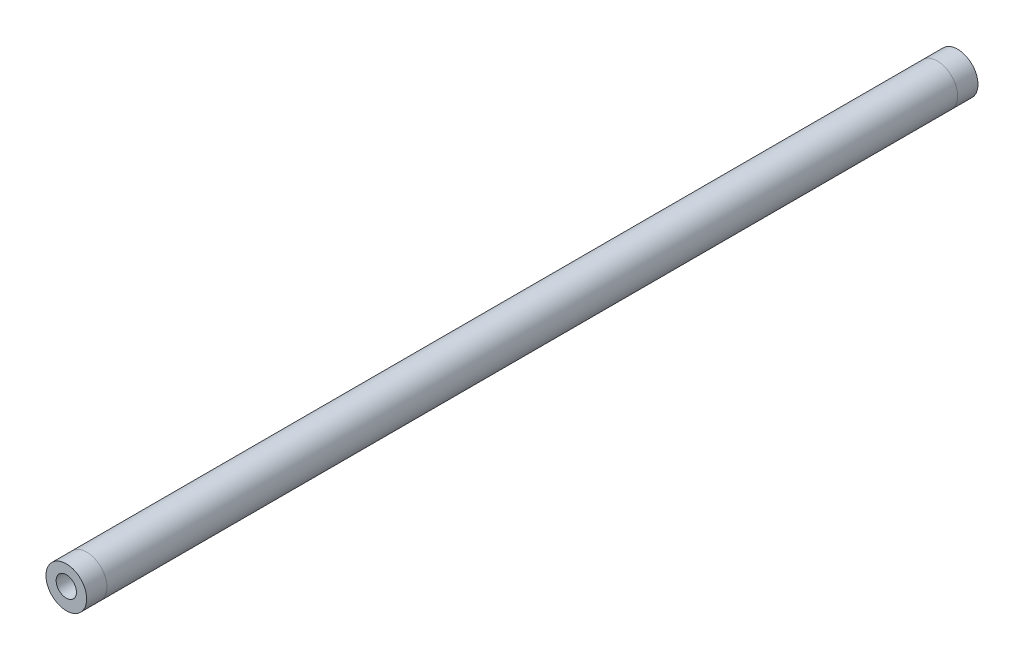
ISO-10303-21;
HEADER;
FILE_DESCRIPTION(('STEP AP214'),'2;1');
FILE_NAME('part.step','',(''),(''),'','','');
FILE_SCHEMA(('AUTOMOTIVE_DESIGN { 1 0 10303 214 1 1 1 1 }'));
ENDSEC;
DATA;
#1=APPLICATION_CONTEXT('core data for automotive mechanical design processes');
#2=APPLICATION_PROTOCOL_DEFINITION('international standard','automotive_design',2000,#1);
#3=PRODUCT_CONTEXT('',#1,'mechanical');
#4=PRODUCT('Part','Part','',(#3));
#5=PRODUCT_RELATED_PRODUCT_CATEGORY('part','',(#4));
#6=PRODUCT_DEFINITION_FORMATION('','',#4);
#7=PRODUCT_DEFINITION_CONTEXT('part definition',#1,'design');
#8=PRODUCT_DEFINITION('design','',#6,#7);
#9=PRODUCT_DEFINITION_SHAPE('','',#8);
#10=(LENGTH_UNIT() NAMED_UNIT(*) SI_UNIT(.MILLI.,.METRE.));
#11=(NAMED_UNIT(*) PLANE_ANGLE_UNIT() SI_UNIT($,.RADIAN.));
#12=(NAMED_UNIT(*) SI_UNIT($,.STERADIAN.) SOLID_ANGLE_UNIT());
#13=UNCERTAINTY_MEASURE_WITH_UNIT(LENGTH_MEASURE(1.E-05),#10,'distance_accuracy_value','');
#14=(GEOMETRIC_REPRESENTATION_CONTEXT(3) GLOBAL_UNCERTAINTY_ASSIGNED_CONTEXT((#13)) GLOBAL_UNIT_ASSIGNED_CONTEXT((#10,
#11,#12)) REPRESENTATION_CONTEXT('',''));
#15=CARTESIAN_POINT('',(0.,0.,0.));
#16=DIRECTION('',(0.,0.,1.));
#17=DIRECTION('',(1.,0.,0.));
#18=AXIS2_PLACEMENT_3D('',#15,#16,#17);
#19=CARTESIAN_POINT('',(0.,0.,-311.692360642138));
#20=DIRECTION('',(0.,0.,1.));
#21=DIRECTION('',(1.,0.,0.));
#22=AXIS2_PLACEMENT_3D('',#19,#20,#21);
#23=CYLINDRICAL_SURFACE('',#22,6.35);
#24=CARTESIAN_POINT('',(0.,0.,-293.7318484));
#25=DIRECTION('',(0.,0.,1.));
#26=DIRECTION('',(1.,0.,0.));
#27=AXIS2_PLACEMENT_3D('',#24,#25,#26);
#28=CIRCLE('',#27,6.35);
#29=CARTESIAN_POINT('',(6.35,0.,-293.7318484));
#30=VERTEX_POINT('',#29);
#31=EDGE_CURVE('E12',#30,#30,#28,.F.);
#32=ORIENTED_EDGE('',*,*,#31,.F.);
#33=EDGE_LOOP('',(#32));
#34=FACE_BOUND('',#33,.T.);
#35=CARTESIAN_POINT('',(0.,0.,-28.2575));
#36=DIRECTION('',(0.,0.,1.));
#37=DIRECTION('',(1.,0.,0.));
#38=AXIS2_PLACEMENT_3D('',#35,#36,#37);
#39=CIRCLE('',#38,6.35);
#40=CARTESIAN_POINT('',(6.35,0.,-28.2575));
#41=VERTEX_POINT('',#40);
#42=EDGE_CURVE('E77',#41,#41,#39,.T.);
#43=ORIENTED_EDGE('',*,*,#42,.F.);
#44=EDGE_LOOP('',(#43));
#45=FACE_BOUND('',#44,.T.);
#46=ADVANCED_FACE('F66',(#34,#45),#23,.T.);
#47=CARTESIAN_POINT('',(0.,0.,-28.2575));
#48=DIRECTION('',(0.,0.,1.));
#49=DIRECTION('',(1.,0.,0.));
#50=AXIS2_PLACEMENT_3D('',#47,#48,#49);
#51=PLANE('',#50);
#52=CARTESIAN_POINT('',(0.,0.,-28.2575));
#53=DIRECTION('',(0.,0.,1.));
#54=DIRECTION('',(1.,0.,0.));
#55=AXIS2_PLACEMENT_3D('',#52,#53,#54);
#56=CIRCLE('',#55,4.7625);
#57=CARTESIAN_POINT('',(4.7625,0.,-28.2575));
#58=VERTEX_POINT('',#57);
#59=EDGE_CURVE('E79',#58,#58,#56,.T.);
#60=ORIENTED_EDGE('',*,*,#59,.F.);
#61=EDGE_LOOP('',(#60));
#62=FACE_BOUND('',#61,.T.);
#63=ORIENTED_EDGE('',*,*,#42,.T.);
#64=EDGE_LOOP('',(#63));
#65=FACE_BOUND('',#64,.T.);
#66=ADVANCED_FACE('F84',(#62,#65),#51,.T.);
#67=CARTESIAN_POINT('',(0.,0.,-311.692360642138));
#68=DIRECTION('',(0.,0.,1.));
#69=DIRECTION('',(1.,0.,0.));
#70=AXIS2_PLACEMENT_3D('',#67,#68,#69);
#71=CYLINDRICAL_SURFACE('',#70,4.7625);
#72=CARTESIAN_POINT('',(0.,0.,-293.7318484));
#73=DIRECTION('',(0.,0.,1.));
#74=DIRECTION('',(1.,0.,0.));
#75=AXIS2_PLACEMENT_3D('',#72,#73,#74);
#76=CIRCLE('',#75,4.7625);
#77=CARTESIAN_POINT('',(4.7625,0.,-293.7318484));
#78=VERTEX_POINT('',#77);
#79=EDGE_CURVE('E69',#78,#78,#76,.F.);
#80=ORIENTED_EDGE('',*,*,#79,.T.);
#81=EDGE_LOOP('',(#80));
#82=FACE_BOUND('',#81,.T.);
#83=ORIENTED_EDGE('',*,*,#59,.T.);
#84=EDGE_LOOP('',(#83));
#85=FACE_BOUND('',#84,.T.);
#86=ADVANCED_FACE('F91',(#82,#85),#71,.F.);
#87=CARTESIAN_POINT('',(0.,0.,-293.7318484));
#88=DIRECTION('',(0.,0.,1.));
#89=DIRECTION('',(1.,0.,0.));
#90=AXIS2_PLACEMENT_3D('',#87,#88,#89);
#91=PLANE('',#90);
#92=ORIENTED_EDGE('',*,*,#31,.T.);
#93=EDGE_LOOP('',(#92));
#94=FACE_BOUND('',#93,.T.);
#95=ORIENTED_EDGE('',*,*,#79,.F.);
#96=EDGE_LOOP('',(#95));
#97=FACE_BOUND('',#96,.T.);
#98=ADVANCED_FACE('F96',(#94,#97),#91,.F.);
#99=CLOSED_SHELL('',(#46,#66,#86,#98));
#100=MANIFOLD_SOLID_BREP('B2',#99);
#101=CARTESIAN_POINT('',(0.,0.,-293.7318484));
#102=DIRECTION('',(0.,0.,1.));
#103=DIRECTION('',(1.,0.,0.));
#104=AXIS2_PLACEMENT_3D('',#101,#102,#103);
#105=PLANE('',#104);
#106=CARTESIAN_POINT('',(0.,0.,-293.7318484));
#107=DIRECTION('',(0.,0.,1.));
#108=DIRECTION('',(1.,0.,0.));
#109=AXIS2_PLACEMENT_3D('',#106,#107,#108);
#110=CIRCLE('',#109,6.35);
#111=CARTESIAN_POINT('',(6.35,0.,-293.7318484));
#112=VERTEX_POINT('',#111);
#113=EDGE_CURVE('E65',#112,#112,#110,.T.);
#114=ORIENTED_EDGE('',*,*,#113,.T.);
#115=EDGE_LOOP('',(#114));
#116=FACE_BOUND('',#115,.T.);
#117=CARTESIAN_POINT('',(0.,0.,-293.7318484));
#118=DIRECTION('',(0.,0.,1.));
#119=DIRECTION('',(1.,0.,0.));
#120=AXIS2_PLACEMENT_3D('',#117,#118,#119);
#121=CIRCLE('',#120,4.7625);
#122=CARTESIAN_POINT('',(-4.7625,0.,-293.7318484));
#123=VERTEX_POINT('',#122);
#124=EDGE_CURVE('E149',#123,#123,#121,.T.);
#125=ORIENTED_EDGE('',*,*,#124,.F.);
#126=EDGE_LOOP('',(#125));
#127=FACE_BOUND('',#126,.T.);
#128=ADVANCED_FACE('F135',(#116,#127),#105,.T.);
#129=CARTESIAN_POINT('',(0.,0.,-293.7318484));
#130=DIRECTION('',(0.,0.,-1.));
#131=DIRECTION('',(-1.,0.,0.));
#132=AXIS2_PLACEMENT_3D('',#129,#130,#131);
#133=CYLINDRICAL_SURFACE('',#132,6.35);
#134=ORIENTED_EDGE('',*,*,#113,.F.);
#135=EDGE_LOOP('',(#134));
#136=FACE_BOUND('',#135,.T.);
#137=CARTESIAN_POINT('',(0.,0.,-300.0818484));
#138=DIRECTION('',(0.,0.,1.));
#139=DIRECTION('',(1.,0.,0.));
#140=AXIS2_PLACEMENT_3D('',#137,#138,#139);
#141=CIRCLE('',#140,6.35);
#142=CARTESIAN_POINT('',(6.35,0.,-300.0818484));
#143=VERTEX_POINT('',#142);
#144=EDGE_CURVE('E147',#143,#143,#141,.T.);
#145=ORIENTED_EDGE('',*,*,#144,.T.);
#146=EDGE_LOOP('',(#145));
#147=FACE_BOUND('',#146,.T.);
#148=ADVANCED_FACE('F137',(#136,#147),#133,.T.);
#149=CARTESIAN_POINT('',(0.,0.235008438761634,-293.7318484));
#150=DIRECTION('',(0.,0.,-1.));
#151=DIRECTION('',(-1.,0.,0.));
#152=AXIS2_PLACEMENT_3D('',#149,#150,#151);
#153=CYLINDRICAL_SURFACE('',#152,3.175);
#154=CARTESIAN_POINT('',(0.,0.235008438761634,-300.0818484));
#155=DIRECTION('',(0.,0.,1.));
#156=DIRECTION('',(1.,0.,0.));
#157=AXIS2_PLACEMENT_3D('',#154,#155,#156);
#158=CIRCLE('',#157,3.175);
#159=CARTESIAN_POINT('',(3.175,0.235008438761634,-300.0818484));
#160=VERTEX_POINT('',#159);
#161=EDGE_CURVE('E139',#160,#160,#158,.T.);
#162=ORIENTED_EDGE('',*,*,#161,.F.);
#163=EDGE_LOOP('',(#162));
#164=FACE_BOUND('',#163,.T.);
#165=CARTESIAN_POINT('',(0.,0.235008438761634,-284.2068484));
#166=DIRECTION('',(0.,0.,1.));
#167=DIRECTION('',(1.,0.,0.));
#168=AXIS2_PLACEMENT_3D('',#165,#166,#167);
#169=CIRCLE('',#168,3.175);
#170=CARTESIAN_POINT('',(3.175,0.235008438761634,-284.2068484));
#171=VERTEX_POINT('',#170);
#172=EDGE_CURVE('E159',#171,#171,#169,.T.);
#173=ORIENTED_EDGE('',*,*,#172,.T.);
#174=EDGE_LOOP('',(#173));
#175=FACE_BOUND('',#174,.T.);
#176=ADVANCED_FACE('F164',(#164,#175),#153,.F.);
#177=CARTESIAN_POINT('',(0.,0.,-300.0818484));
#178=DIRECTION('',(0.,0.,1.));
#179=DIRECTION('',(1.,0.,0.));
#180=AXIS2_PLACEMENT_3D('',#177,#178,#179);
#181=PLANE('',#180);
#182=ORIENTED_EDGE('',*,*,#144,.F.);
#183=EDGE_LOOP('',(#182));
#184=FACE_BOUND('',#183,.T.);
#185=ORIENTED_EDGE('',*,*,#161,.T.);
#186=EDGE_LOOP('',(#185));
#187=FACE_BOUND('',#186,.T.);
#188=ADVANCED_FACE('F169',(#184,#187),#181,.F.);
#189=CARTESIAN_POINT('',(0.,0.,-284.2068484));
#190=DIRECTION('',(0.,0.,1.));
#191=DIRECTION('',(1.,0.,0.));
#192=AXIS2_PLACEMENT_3D('',#189,#190,#191);
#193=PLANE('',#192);
#194=CARTESIAN_POINT('',(0.,0.,-284.2068484));
#195=DIRECTION('',(0.,0.,1.));
#196=DIRECTION('',(1.,0.,0.));
#197=AXIS2_PLACEMENT_3D('',#194,#195,#196);
#198=CIRCLE('',#197,4.7625);
#199=CARTESIAN_POINT('',(-4.7625,0.,-284.2068484));
#200=VERTEX_POINT('',#199);
#201=EDGE_CURVE('E152',#200,#200,#198,.T.);
#202=ORIENTED_EDGE('',*,*,#201,.T.);
#203=EDGE_LOOP('',(#202));
#204=FACE_BOUND('',#203,.T.);
#205=ORIENTED_EDGE('',*,*,#172,.F.);
#206=EDGE_LOOP('',(#205));
#207=FACE_BOUND('',#206,.T.);
#208=ADVANCED_FACE('F166',(#204,#207),#193,.T.);
#209=CARTESIAN_POINT('',(0.,0.,-284.2068484));
#210=DIRECTION('',(0.,0.,-1.));
#211=DIRECTION('',(-1.,0.,0.));
#212=AXIS2_PLACEMENT_3D('',#209,#210,#211);
#213=CYLINDRICAL_SURFACE('',#212,4.7625);
#214=CARTESIAN_POINT('',(-4.7625,0.,-284.2068484));
#215=CARTESIAN_POINT('',(-4.7625,0.,-284.30606715));
#216=CARTESIAN_POINT('',(-4.7625,0.,-284.4052859));
#217=CARTESIAN_POINT('',(-4.7625,0.,-284.6037234));
#218=CARTESIAN_POINT('',(-4.7625,0.,-284.70294215));
#219=CARTESIAN_POINT('',(-4.7625,0.,-284.90137965));
#220=CARTESIAN_POINT('',(-4.7625,0.,-285.0005984));
#221=CARTESIAN_POINT('',(-4.7625,0.,-285.1990359));
#222=CARTESIAN_POINT('',(-4.7625,0.,-285.29825465));
#223=CARTESIAN_POINT('',(-4.7625,0.,-285.49669215));
#224=CARTESIAN_POINT('',(-4.7625,0.,-285.5959109));
#225=CARTESIAN_POINT('',(-4.7625,0.,-285.7943484));
#226=CARTESIAN_POINT('',(-4.7625,0.,-285.89356715));
#227=CARTESIAN_POINT('',(-4.7625,0.,-286.09200465));
#228=CARTESIAN_POINT('',(-4.7625,0.,-286.1912234));
#229=CARTESIAN_POINT('',(-4.7625,0.,-286.3896609));
#230=CARTESIAN_POINT('',(-4.7625,0.,-286.48887965));
#231=CARTESIAN_POINT('',(-4.7625,0.,-286.68731715));
#232=CARTESIAN_POINT('',(-4.7625,0.,-286.7865359));
#233=CARTESIAN_POINT('',(-4.7625,0.,-286.9849734));
#234=CARTESIAN_POINT('',(-4.7625,0.,-287.08419215));
#235=CARTESIAN_POINT('',(-4.7625,0.,-287.28262965));
#236=CARTESIAN_POINT('',(-4.7625,0.,-287.3818484));
#237=CARTESIAN_POINT('',(-4.7625,0.,-287.5802859));
#238=CARTESIAN_POINT('',(-4.7625,0.,-287.67950465));
#239=CARTESIAN_POINT('',(-4.7625,0.,-287.87794215));
#240=CARTESIAN_POINT('',(-4.7625,0.,-287.9771609));
#241=CARTESIAN_POINT('',(-4.7625,0.,-288.1755984));
#242=CARTESIAN_POINT('',(-4.7625,0.,-288.27481715));
#243=CARTESIAN_POINT('',(-4.7625,0.,-288.47325465));
#244=CARTESIAN_POINT('',(-4.7625,0.,-288.5724734));
#245=CARTESIAN_POINT('',(-4.7625,0.,-288.7709109));
#246=CARTESIAN_POINT('',(-4.7625,0.,-288.87012965));
#247=CARTESIAN_POINT('',(-4.7625,0.,-289.06856715));
#248=CARTESIAN_POINT('',(-4.7625,0.,-289.1677859));
#249=CARTESIAN_POINT('',(-4.7625,0.,-289.3662234));
#250=CARTESIAN_POINT('',(-4.7625,0.,-289.46544215));
#251=CARTESIAN_POINT('',(-4.7625,0.,-289.66387965));
#252=CARTESIAN_POINT('',(-4.7625,0.,-289.7630984));
#253=CARTESIAN_POINT('',(-4.7625,0.,-289.9615359));
#254=CARTESIAN_POINT('',(-4.7625,0.,-290.06075465));
#255=CARTESIAN_POINT('',(-4.7625,0.,-290.25919215));
#256=CARTESIAN_POINT('',(-4.7625,0.,-290.3584109));
#257=CARTESIAN_POINT('',(-4.7625,0.,-290.5568484));
#258=CARTESIAN_POINT('',(-4.7625,0.,-290.65606715));
#259=CARTESIAN_POINT('',(-4.7625,0.,-290.85450465));
#260=CARTESIAN_POINT('',(-4.7625,0.,-290.9537234));
#261=CARTESIAN_POINT('',(-4.7625,0.,-291.1521609));
#262=CARTESIAN_POINT('',(-4.7625,0.,-291.25137965));
#263=CARTESIAN_POINT('',(-4.7625,0.,-291.44981715));
#264=CARTESIAN_POINT('',(-4.7625,0.,-291.5490359));
#265=CARTESIAN_POINT('',(-4.7625,0.,-291.7474734));
#266=CARTESIAN_POINT('',(-4.7625,0.,-291.84669215));
#267=CARTESIAN_POINT('',(-4.7625,0.,-292.04512965));
#268=CARTESIAN_POINT('',(-4.7625,0.,-292.1443484));
#269=CARTESIAN_POINT('',(-4.7625,0.,-292.3427859));
#270=CARTESIAN_POINT('',(-4.7625,0.,-292.44200465));
#271=CARTESIAN_POINT('',(-4.7625,0.,-292.64044215));
#272=CARTESIAN_POINT('',(-4.7625,0.,-292.7396609));
#273=CARTESIAN_POINT('',(-4.7625,0.,-292.9380984));
#274=CARTESIAN_POINT('',(-4.7625,0.,-293.03731715));
#275=CARTESIAN_POINT('',(-4.7625,0.,-293.23575465));
#276=CARTESIAN_POINT('',(-4.7625,0.,-293.3349734));
#277=CARTESIAN_POINT('',(-4.7625,0.,-293.5334109));
#278=CARTESIAN_POINT('',(-4.7625,0.,-293.63262965));
#279=CARTESIAN_POINT('',(-4.7625,0.,-293.7318484));
#280=B_SPLINE_CURVE_WITH_KNOTS('',3,(#214,#215,#216,#217,#218,#219,#220,#221,#222,#223,#224,
#225,#226,#227,#228,#229,#230,#231,#232,#233,#234,#235,#236,#237,#238,#239,#240,#241,#242,#243,
#244,#245,#246,#247,#248,#249,#250,#251,#252,#253,#254,#255,#256,#257,#258,#259,#260,#261,#262,
#263,#264,#265,#266,#267,#268,#269,#270,#271,#272,#273,#274,#275,#276,#277,#278,#279),
.UNSPECIFIED.,.F.,.F.,(4,2,2,2,2,2,2,2,2,2,2,2,2,2,2,2,2,2,2,2,2,2,2,2,2,2,2,2,2,2,2,2,4),(0.,
0.297656249999945,0.595312499999945,0.892968749999945,1.19062499999995,1.48828124999995,
1.78593749999995,2.08359374999995,2.38124999999995,2.67890624999995,2.97656249999995,
3.27421874999995,3.57187499999995,3.86953124999995,4.16718749999995,4.46484374999995,
4.76249999999995,5.06015624999995,5.35781249999995,5.65546874999995,5.95312499999995,
6.25078124999995,6.54843749999995,6.84609374999995,7.14374999999995,7.44140624999995,
7.73906249999995,8.03671874999995,8.33437499999995,8.63203124999995,8.92968749999995,
9.22734374999995,9.52499999999995),.UNSPECIFIED.);
#281=EDGE_CURVE('BSEAM168',#200,#123,#280,.T.);
#282=ORIENTED_EDGE('',*,*,#201,.F.);
#283=ORIENTED_EDGE('',*,*,#124,.T.);
#284=ORIENTED_EDGE('',*,*,#281,.T.);
#285=ORIENTED_EDGE('',*,*,#281,.F.);
#286=EDGE_LOOP('',(#282,#284,#283,#285));
#287=FACE_BOUND('',#286,.T.);
#288=ADVANCED_FACE('F168',(#287),#213,.T.);
#289=CLOSED_SHELL('',(#128,#148,#176,#188,#208,#288));
#290=MANIFOLD_SOLID_BREP('B7',#289);
#291=CARTESIAN_POINT('',(0.,0.,-28.2575));
#292=DIRECTION('',(0.,0.,1.));
#293=DIRECTION('',(1.,0.,0.));
#294=AXIS2_PLACEMENT_3D('',#291,#292,#293);
#295=CYLINDRICAL_SURFACE('',#294,6.35);
#296=CARTESIAN_POINT('',(0.,0.,-28.2575));
#297=DIRECTION('',(0.,0.,1.));
#298=DIRECTION('',(1.,0.,0.));
#299=AXIS2_PLACEMENT_3D('',#296,#297,#298);
#300=CIRCLE('',#299,6.35);
#301=CARTESIAN_POINT('',(6.35,0.,-28.2575));
#302=VERTEX_POINT('',#301);
#303=EDGE_CURVE('E134',#302,#302,#300,.T.);
#304=ORIENTED_EDGE('',*,*,#303,.T.);
#305=EDGE_LOOP('',(#304));
#306=FACE_BOUND('',#305,.T.);
#307=CARTESIAN_POINT('',(0.,0.,-21.9075));
#308=DIRECTION('',(0.,0.,1.));
#309=DIRECTION('',(1.,0.,0.));
#310=AXIS2_PLACEMENT_3D('',#307,#308,#309);
#311=CIRCLE('',#310,6.35);
#312=CARTESIAN_POINT('',(6.35,0.,-21.9075));
#313=VERTEX_POINT('',#312);
#314=EDGE_CURVE('E247',#313,#313,#311,.T.);
#315=ORIENTED_EDGE('',*,*,#314,.F.);
#316=EDGE_LOOP('',(#315));
#317=FACE_BOUND('',#316,.T.);
#318=ADVANCED_FACE('F236',(#306,#317),#295,.T.);
#319=CARTESIAN_POINT('',(0.,0.235008438761634,-28.2575));
#320=DIRECTION('',(0.,0.,1.));
#321=DIRECTION('',(1.,0.,0.));
#322=AXIS2_PLACEMENT_3D('',#319,#320,#321);
#323=CYLINDRICAL_SURFACE('',#322,3.175);
#324=CARTESIAN_POINT('',(0.,0.235008438761634,-21.9075));
#325=DIRECTION('',(0.,0.,1.));
#326=DIRECTION('',(1.,0.,0.));
#327=AXIS2_PLACEMENT_3D('',#324,#325,#326);
#328=CIRCLE('',#327,3.175);
#329=CARTESIAN_POINT('',(3.175,0.235008438761634,-21.9075));
#330=VERTEX_POINT('',#329);
#331=EDGE_CURVE('E239',#330,#330,#328,.T.);
#332=ORIENTED_EDGE('',*,*,#331,.T.);
#333=EDGE_LOOP('',(#332));
#334=FACE_BOUND('',#333,.T.);
#335=CARTESIAN_POINT('',(0.,0.235008438761634,-37.7825));
#336=DIRECTION('',(0.,0.,1.));
#337=DIRECTION('',(1.,0.,0.));
#338=AXIS2_PLACEMENT_3D('',#335,#336,#337);
#339=CIRCLE('',#338,3.175);
#340=CARTESIAN_POINT('',(3.175,0.235008438761634,-37.7825));
#341=VERTEX_POINT('',#340);
#342=EDGE_CURVE('E259',#341,#341,#339,.T.);
#343=ORIENTED_EDGE('',*,*,#342,.F.);
#344=EDGE_LOOP('',(#343));
#345=FACE_BOUND('',#344,.T.);
#346=ADVANCED_FACE('F267',(#334,#345),#323,.F.);
#347=CARTESIAN_POINT('',(0.,0.,-28.2575));
#348=DIRECTION('',(0.,0.,1.));
#349=DIRECTION('',(1.,0.,0.));
#350=AXIS2_PLACEMENT_3D('',#347,#348,#349);
#351=PLANE('',#350);
#352=CARTESIAN_POINT('',(0.,0.,-28.2575));
#353=DIRECTION('',(0.,0.,1.));
#354=DIRECTION('',(1.,0.,0.));
#355=AXIS2_PLACEMENT_3D('',#352,#353,#354);
#356=CIRCLE('',#355,4.7625);
#357=CARTESIAN_POINT('',(4.7625,0.,-28.2575));
#358=VERTEX_POINT('',#357);
#359=EDGE_CURVE('E249',#358,#358,#356,.T.);
#360=ORIENTED_EDGE('',*,*,#359,.T.);
#361=EDGE_LOOP('',(#360));
#362=FACE_BOUND('',#361,.T.);
#363=ORIENTED_EDGE('',*,*,#303,.F.);
#364=EDGE_LOOP('',(#363));
#365=FACE_BOUND('',#364,.T.);
#366=ADVANCED_FACE('F269',(#362,#365),#351,.F.);
#367=CARTESIAN_POINT('',(0.,0.,-21.9075));
#368=DIRECTION('',(0.,0.,1.));
#369=DIRECTION('',(1.,0.,0.));
#370=AXIS2_PLACEMENT_3D('',#367,#368,#369);
#371=PLANE('',#370);
#372=ORIENTED_EDGE('',*,*,#314,.T.);
#373=EDGE_LOOP('',(#372));
#374=FACE_BOUND('',#373,.T.);
#375=ORIENTED_EDGE('',*,*,#331,.F.);
#376=EDGE_LOOP('',(#375));
#377=FACE_BOUND('',#376,.T.);
#378=ADVANCED_FACE('F275',(#374,#377),#371,.T.);
#379=CARTESIAN_POINT('',(0.,0.,-37.7825));
#380=DIRECTION('',(0.,0.,1.));
#381=DIRECTION('',(1.,0.,0.));
#382=AXIS2_PLACEMENT_3D('',#379,#380,#381);
#383=CYLINDRICAL_SURFACE('',#382,4.7625);
#384=CARTESIAN_POINT('',(0.,0.,-37.7825));
#385=DIRECTION('',(0.,0.,1.));
#386=DIRECTION('',(1.,0.,0.));
#387=AXIS2_PLACEMENT_3D('',#384,#385,#386);
#388=CIRCLE('',#387,4.7625);
#389=CARTESIAN_POINT('',(4.7625,0.,-37.7825));
#390=VERTEX_POINT('',#389);
#391=EDGE_CURVE('E252',#390,#390,#388,.T.);
#392=CARTESIAN_POINT('',(4.7625,0.,-37.7825));
#393=CARTESIAN_POINT('',(4.7625,0.,-37.68328125));
#394=CARTESIAN_POINT('',(4.7625,0.,-37.5840625));
#395=CARTESIAN_POINT('',(4.7625,0.,-37.385625));
#396=CARTESIAN_POINT('',(4.7625,0.,-37.28640625));
#397=CARTESIAN_POINT('',(4.7625,0.,-37.08796875));
#398=CARTESIAN_POINT('',(4.7625,0.,-36.98875));
#399=CARTESIAN_POINT('',(4.7625,0.,-36.7903125));
#400=CARTESIAN_POINT('',(4.7625,0.,-36.69109375));
#401=CARTESIAN_POINT('',(4.7625,0.,-36.49265625));
#402=CARTESIAN_POINT('',(4.7625,0.,-36.3934375));
#403=CARTESIAN_POINT('',(4.7625,0.,-36.195));
#404=CARTESIAN_POINT('',(4.7625,0.,-36.09578125));
#405=CARTESIAN_POINT('',(4.7625,0.,-35.89734375));
#406=CARTESIAN_POINT('',(4.7625,0.,-35.798125));
#407=CARTESIAN_POINT('',(4.7625,0.,-35.5996875));
#408=CARTESIAN_POINT('',(4.7625,0.,-35.50046875));
#409=CARTESIAN_POINT('',(4.7625,0.,-35.30203125));
#410=CARTESIAN_POINT('',(4.7625,0.,-35.2028125));
#411=CARTESIAN_POINT('',(4.7625,0.,-35.004375));
#412=CARTESIAN_POINT('',(4.7625,0.,-34.90515625));
#413=CARTESIAN_POINT('',(4.7625,0.,-34.70671875));
#414=CARTESIAN_POINT('',(4.7625,0.,-34.6075));
#415=CARTESIAN_POINT('',(4.7625,0.,-34.4090625));
#416=CARTESIAN_POINT('',(4.7625,0.,-34.30984375));
#417=CARTESIAN_POINT('',(4.7625,0.,-34.11140625));
#418=CARTESIAN_POINT('',(4.7625,0.,-34.0121875));
#419=CARTESIAN_POINT('',(4.7625,0.,-33.81375));
#420=CARTESIAN_POINT('',(4.7625,0.,-33.71453125));
#421=CARTESIAN_POINT('',(4.7625,0.,-33.51609375));
#422=CARTESIAN_POINT('',(4.7625,0.,-33.416875));
#423=CARTESIAN_POINT('',(4.7625,0.,-33.2184375));
#424=CARTESIAN_POINT('',(4.7625,0.,-33.11921875));
#425=CARTESIAN_POINT('',(4.7625,0.,-32.92078125));
#426=CARTESIAN_POINT('',(4.7625,0.,-32.8215625));
#427=CARTESIAN_POINT('',(4.7625,0.,-32.623125));
#428=CARTESIAN_POINT('',(4.7625,0.,-32.52390625));
#429=CARTESIAN_POINT('',(4.7625,0.,-32.32546875));
#430=CARTESIAN_POINT('',(4.7625,0.,-32.22625));
#431=CARTESIAN_POINT('',(4.7625,0.,-32.0278125));
#432=CARTESIAN_POINT('',(4.7625,0.,-31.92859375));
#433=CARTESIAN_POINT('',(4.7625,0.,-31.73015625));
#434=CARTESIAN_POINT('',(4.7625,0.,-31.6309375));
#435=CARTESIAN_POINT('',(4.7625,0.,-31.4325));
#436=CARTESIAN_POINT('',(4.7625,0.,-31.33328125));
#437=CARTESIAN_POINT('',(4.7625,0.,-31.13484375));
#438=CARTESIAN_POINT('',(4.7625,0.,-31.035625));
#439=CARTESIAN_POINT('',(4.7625,0.,-30.8371875));
#440=CARTESIAN_POINT('',(4.7625,0.,-30.73796875));
#441=CARTESIAN_POINT('',(4.7625,0.,-30.53953125));
#442=CARTESIAN_POINT('',(4.7625,0.,-30.4403125));
#443=CARTESIAN_POINT('',(4.7625,0.,-30.241875));
#444=CARTESIAN_POINT('',(4.7625,0.,-30.14265625));
#445=CARTESIAN_POINT('',(4.7625,0.,-29.94421875));
#446=CARTESIAN_POINT('',(4.7625,0.,-29.845));
#447=CARTESIAN_POINT('',(4.7625,0.,-29.6465625));
#448=CARTESIAN_POINT('',(4.7625,0.,-29.54734375));
#449=CARTESIAN_POINT('',(4.7625,0.,-29.34890625));
#450=CARTESIAN_POINT('',(4.7625,0.,-29.2496875));
#451=CARTESIAN_POINT('',(4.7625,0.,-29.05125));
#452=CARTESIAN_POINT('',(4.7625,0.,-28.95203125));
#453=CARTESIAN_POINT('',(4.7625,0.,-28.75359375));
#454=CARTESIAN_POINT('',(4.7625,0.,-28.654375));
#455=CARTESIAN_POINT('',(4.7625,0.,-28.4559375));
#456=CARTESIAN_POINT('',(4.7625,0.,-28.35671875));
#457=CARTESIAN_POINT('',(4.7625,0.,-28.2575));
#458=B_SPLINE_CURVE_WITH_KNOTS('',3,(#392,#393,#394,#395,#396,#397,#398,#399,#400,#401,#402,
#403,#404,#405,#406,#407,#408,#409,#410,#411,#412,#413,#414,#415,#416,#417,#418,#419,#420,#421,
#422,#423,#424,#425,#426,#427,#428,#429,#430,#431,#432,#433,#434,#435,#436,#437,#438,#439,#440,
#441,#442,#443,#444,#445,#446,#447,#448,#449,#450,#451,#452,#453,#454,#455,#456,#457),
.UNSPECIFIED.,.F.,.F.,(4,2,2,2,2,2,2,2,2,2,2,2,2,2,2,2,2,2,2,2,2,2,2,2,2,2,2,2,2,2,2,2,4),(0.,
0.297656249999993,0.595312499999993,0.892968749999994,1.19062499999999,1.48828124999999,
1.78593749999999,2.08359374999999,2.38124999999999,2.67890624999999,2.97656249999999,
3.27421874999999,3.571875,3.86953125,4.1671875,4.46484375,4.7625,5.06015625,5.3578125,
5.65546875,5.953125,6.25078125,6.5484375,6.84609375,7.14375,7.44140625,7.7390625,8.03671875,
8.334375,8.63203125,8.9296875,9.22734375,9.525),.UNSPECIFIED.);
#459=EDGE_CURVE('BSEAM280',#390,#358,#458,.T.);
#460=ORIENTED_EDGE('',*,*,#391,.T.);
#461=ORIENTED_EDGE('',*,*,#359,.F.);
#462=ORIENTED_EDGE('',*,*,#459,.T.);
#463=ORIENTED_EDGE('',*,*,#459,.F.);
#464=EDGE_LOOP('',(#460,#462,#461,#463));
#465=FACE_BOUND('',#464,.T.);
#466=ADVANCED_FACE('F280',(#465),#383,.T.);
#467=CARTESIAN_POINT('',(0.,0.,-37.7825));
#468=DIRECTION('',(0.,0.,1.));
#469=DIRECTION('',(1.,0.,0.));
#470=AXIS2_PLACEMENT_3D('',#467,#468,#469);
#471=PLANE('',#470);
#472=ORIENTED_EDGE('',*,*,#342,.T.);
#473=EDGE_LOOP('',(#472));
#474=FACE_BOUND('',#473,.T.);
#475=ORIENTED_EDGE('',*,*,#391,.F.);
#476=EDGE_LOOP('',(#475));
#477=FACE_BOUND('',#476,.T.);
#478=ADVANCED_FACE('F264',(#474,#477),#471,.F.);
#479=CLOSED_SHELL('',(#318,#346,#366,#378,#466,#478));
#480=MANIFOLD_SOLID_BREP('B60',#479);
#481=ADVANCED_BREP_SHAPE_REPRESENTATION('',(#18,#100,#290,#480),#14);
#482=SHAPE_DEFINITION_REPRESENTATION(#9,#481);
ENDSEC;
END-ISO-10303-21;
